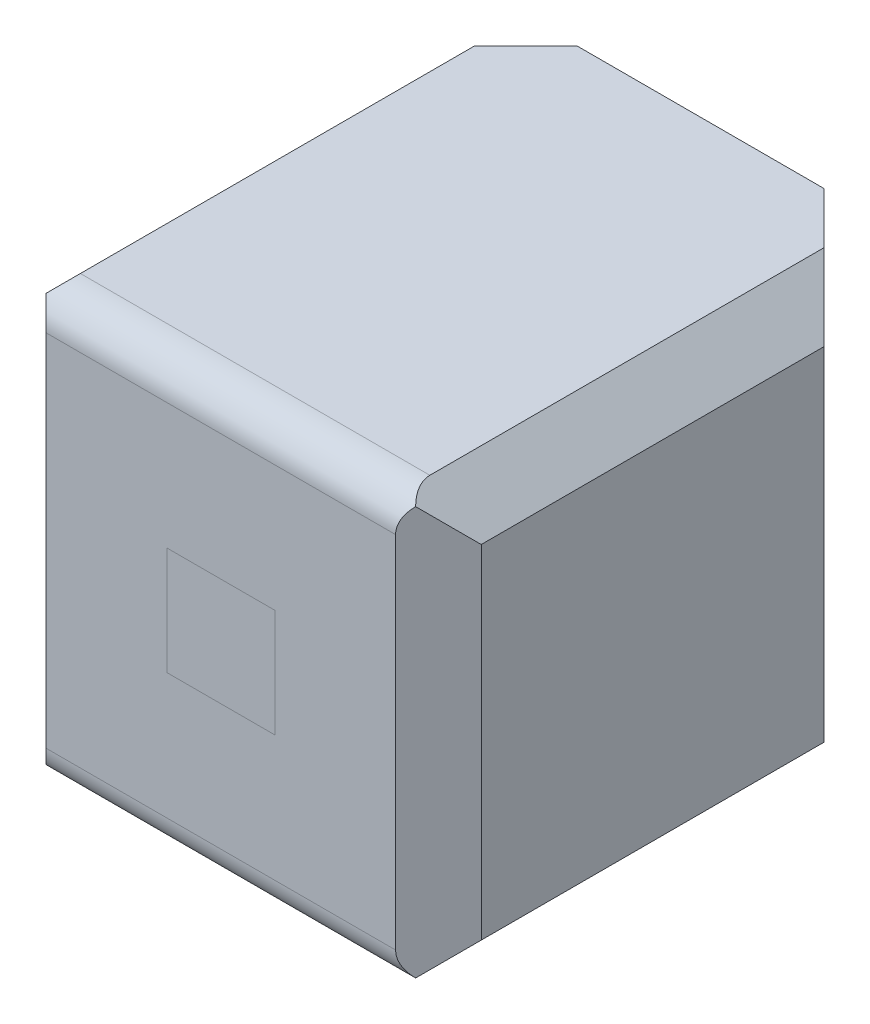
ISO-10303-21;
HEADER;
FILE_DESCRIPTION(('STEP AP214'),'2;1');
FILE_NAME('part.step','',(''),(''),'','','');
FILE_SCHEMA(('AUTOMOTIVE_DESIGN { 1 0 10303 214 1 1 1 1 }'));
ENDSEC;
DATA;
#1=APPLICATION_CONTEXT('core data for automotive mechanical design processes');
#2=APPLICATION_PROTOCOL_DEFINITION('international standard','automotive_design',2000,#1);
#3=PRODUCT_CONTEXT('',#1,'mechanical');
#4=PRODUCT('Part','Part','',(#3));
#5=PRODUCT_RELATED_PRODUCT_CATEGORY('part','',(#4));
#6=PRODUCT_DEFINITION_FORMATION('','',#4);
#7=PRODUCT_DEFINITION_CONTEXT('part definition',#1,'design');
#8=PRODUCT_DEFINITION('design','',#6,#7);
#9=PRODUCT_DEFINITION_SHAPE('','',#8);
#10=(LENGTH_UNIT() NAMED_UNIT(*) SI_UNIT(.MILLI.,.METRE.));
#11=(NAMED_UNIT(*) PLANE_ANGLE_UNIT() SI_UNIT($,.RADIAN.));
#12=(NAMED_UNIT(*) SI_UNIT($,.STERADIAN.) SOLID_ANGLE_UNIT());
#13=UNCERTAINTY_MEASURE_WITH_UNIT(LENGTH_MEASURE(1.E-05),#10,'distance_accuracy_value','');
#14=(GEOMETRIC_REPRESENTATION_CONTEXT(3) GLOBAL_UNCERTAINTY_ASSIGNED_CONTEXT((#13)) GLOBAL_UNIT_ASSIGNED_CONTEXT((#10,
#11,#12)) REPRESENTATION_CONTEXT('',''));
#15=CARTESIAN_POINT('',(0.,0.,0.));
#16=DIRECTION('',(0.,0.,1.));
#17=DIRECTION('',(1.,0.,0.));
#18=AXIS2_PLACEMENT_3D('',#15,#16,#17);
#19=CARTESIAN_POINT('',(-7.935,-0.315,4.415));
#20=DIRECTION('',(0.,0.,-1.));
#21=DIRECTION('',(0.,1.,0.));
#22=AXIS2_PLACEMENT_3D('',#19,#20,#21);
#23=PLANE('',#22);
#24=DIRECTION('',(0.,1.,0.));
#25=VECTOR('',#24,1.);
#26=CARTESIAN_POINT('',(-7.935,1.26,4.415));
#27=LINE('',#26,#25);
#28=CARTESIAN_POINT('',(-7.935,-0.315,4.415));
#29=VERTEX_POINT('',#28);
#30=CARTESIAN_POINT('',(-7.935,0.315,4.415));
#31=VERTEX_POINT('',#30);
#32=EDGE_CURVE('E11',#29,#31,#27,.T.);
#33=ORIENTED_EDGE('',*,*,#32,.F.);
#34=DIRECTION('',(-1.,0.,0.));
#35=VECTOR('',#34,1.);
#36=CARTESIAN_POINT('',(-8.844,-0.315,4.415));
#37=LINE('',#36,#35);
#38=CARTESIAN_POINT('',(-7.305,-0.315,4.415));
#39=VERTEX_POINT('',#38);
#40=EDGE_CURVE('E25',#39,#29,#37,.T.);
#41=ORIENTED_EDGE('',*,*,#40,.F.);
#42=DIRECTION('',(0.,-1.,0.));
#43=VECTOR('',#42,1.);
#44=CARTESIAN_POINT('',(-7.305,1.26,4.415));
#45=LINE('',#44,#43);
#46=CARTESIAN_POINT('',(-7.305,0.315,4.415));
#47=VERTEX_POINT('',#46);
#48=EDGE_CURVE('E399',#47,#39,#45,.T.);
#49=ORIENTED_EDGE('',*,*,#48,.F.);
#50=DIRECTION('',(1.,0.,0.));
#51=VECTOR('',#50,1.);
#52=CARTESIAN_POINT('',(-8.844,0.315,4.415));
#53=LINE('',#52,#51);
#54=EDGE_CURVE('E396',#31,#47,#53,.T.);
#55=ORIENTED_EDGE('',*,*,#54,.F.);
#56=EDGE_LOOP('',(#33,#41,#49,#55));
#57=FACE_BOUND('',#56,.T.);
#58=ADVANCED_FACE('F17',(#57),#23,.F.);
#59=CARTESIAN_POINT('',(-7.935,0.315,1.915));
#60=DIRECTION('',(0.,0.,1.));
#61=DIRECTION('',(0.,-1.,0.));
#62=AXIS2_PLACEMENT_3D('',#59,#60,#61);
#63=PLANE('',#62);
#64=DIRECTION('',(0.,-1.,0.));
#65=VECTOR('',#64,1.);
#66=CARTESIAN_POINT('',(-7.935,-0.84,1.915));
#67=LINE('',#66,#65);
#68=CARTESIAN_POINT('',(-7.935,0.315,1.915));
#69=VERTEX_POINT('',#68);
#70=CARTESIAN_POINT('',(-7.935,-0.315,1.915));
#71=VERTEX_POINT('',#70);
#72=EDGE_CURVE('E393',#69,#71,#67,.T.);
#73=ORIENTED_EDGE('',*,*,#72,.F.);
#74=DIRECTION('',(-1.,0.,0.));
#75=VECTOR('',#74,1.);
#76=CARTESIAN_POINT('',(-8.844,0.315,1.915));
#77=LINE('',#76,#75);
#78=CARTESIAN_POINT('',(-7.305,0.315,1.915));
#79=VERTEX_POINT('',#78);
#80=EDGE_CURVE('E389',#79,#69,#77,.T.);
#81=ORIENTED_EDGE('',*,*,#80,.F.);
#82=DIRECTION('',(0.,1.,0.));
#83=VECTOR('',#82,1.);
#84=CARTESIAN_POINT('',(-7.305,-0.84,1.915));
#85=LINE('',#84,#83);
#86=CARTESIAN_POINT('',(-7.305,-0.315,1.915));
#87=VERTEX_POINT('',#86);
#88=EDGE_CURVE('E385',#87,#79,#85,.T.);
#89=ORIENTED_EDGE('',*,*,#88,.F.);
#90=DIRECTION('',(1.,0.,0.));
#91=VECTOR('',#90,1.);
#92=CARTESIAN_POINT('',(-8.844,-0.315,1.915));
#93=LINE('',#92,#91);
#94=EDGE_CURVE('E381',#71,#87,#93,.T.);
#95=ORIENTED_EDGE('',*,*,#94,.F.);
#96=EDGE_LOOP('',(#73,#81,#89,#95));
#97=FACE_BOUND('',#96,.T.);
#98=ADVANCED_FACE('F407',(#97),#63,.F.);
#99=CARTESIAN_POINT('',(-8.89,-1.2,1.965));
#100=DIRECTION('',(-1.,0.,0.));
#101=DIRECTION('',(0.,0.,1.));
#102=AXIS2_PLACEMENT_3D('',#99,#100,#101);
#103=PLANE('',#102);
#104=DIRECTION('',(0.,-1.,0.));
#105=VECTOR('',#104,1.);
#106=CARTESIAN_POINT('',(-8.89,1.4297056274844,4.165));
#107=LINE('',#106,#105);
#108=CARTESIAN_POINT('',(-8.89,1.,4.165));
#109=VERTEX_POINT('',#108);
#110=CARTESIAN_POINT('',(-8.89,-1.,4.165));
#111=VERTEX_POINT('',#110);
#112=EDGE_CURVE('E378',#109,#111,#107,.T.);
#113=ORIENTED_EDGE('',*,*,#112,.F.);
#114=DIRECTION('',(0.,0.,1.));
#115=VECTOR('',#114,1.);
#116=CARTESIAN_POINT('',(-8.89,1.,1.67085786437627));
#117=LINE('',#116,#115);
#118=CARTESIAN_POINT('',(-8.89,1.,2.16499999999996));
#119=VERTEX_POINT('',#118);
#120=EDGE_CURVE('E374',#119,#109,#117,.T.);
#121=ORIENTED_EDGE('',*,*,#120,.F.);
#122=DIRECTION('',(0.,1.,0.));
#123=VECTOR('',#122,1.);
#124=CARTESIAN_POINT('',(-8.89,1.5,2.16499999999996));
#125=LINE('',#124,#123);
#126=CARTESIAN_POINT('',(-8.89,-1.,2.16499999999995));
#127=VERTEX_POINT('',#126);
#128=EDGE_CURVE('E370',#127,#119,#125,.T.);
#129=ORIENTED_EDGE('',*,*,#128,.F.);
#130=DIRECTION('',(0.,0.,-1.));
#131=VECTOR('',#130,1.);
#132=CARTESIAN_POINT('',(-8.89,-1.,1.67085786437627));
#133=LINE('',#132,#131);
#134=EDGE_CURVE('E366',#111,#127,#133,.T.);
#135=ORIENTED_EDGE('',*,*,#134,.F.);
#136=EDGE_LOOP('',(#113,#121,#129,#135));
#137=FACE_BOUND('',#136,.T.);
#138=ADVANCED_FACE('F412',(#137),#103,.T.);
#139=CARTESIAN_POINT('',(-9.33926406871194,1.4297056274844,3.71573593128808));
#140=DIRECTION('',(-0.707106781186542,0.,0.707106781186553));
#141=DIRECTION('',(0.,1.,0.));
#142=AXIS2_PLACEMENT_3D('',#139,#140,#141);
#143=PLANE('',#142);
#144=CARTESIAN_POINT('',(-8.84,1.05,4.215));
#145=DIRECTION('',(0.707106781186542,0.,-0.707106781186553));
#146=DIRECTION('',(0.707106781186553,0.,0.707106781186542));
#147=AXIS2_PLACEMENT_3D('',#144,#145,#146);
#148=ELLIPSE('',#147,0.28284271247462,0.2);
#149=CARTESIAN_POINT('',(-8.69857864376258,1.19142135623743,4.35642135623719));
#150=VERTEX_POINT('',#149);
#151=CARTESIAN_POINT('',(-8.64,1.05,4.415));
#152=VERTEX_POINT('',#151);
#153=EDGE_CURVE('E363',#150,#152,#148,.T.);
#154=ORIENTED_EDGE('',*,*,#153,.F.);
#155=DIRECTION('',(0.577350269190128,0.577350269190118,0.577350269188631));
#156=VECTOR('',#155,1.);
#157=CARTESIAN_POINT('',(-8.89,1.,4.165));
#158=LINE('',#157,#156);
#159=EDGE_CURVE('E359',#109,#150,#158,.T.);
#160=ORIENTED_EDGE('',*,*,#159,.F.);
#161=ORIENTED_EDGE('',*,*,#112,.T.);
#162=DIRECTION('',(-0.577350269190122,0.577350269190124,-0.577350269188631));
#163=VECTOR('',#162,1.);
#164=CARTESIAN_POINT('',(-8.6985786437617,-1.1914213562383,4.35642135623781));
#165=LINE('',#164,#163);
#166=CARTESIAN_POINT('',(-8.69857864376258,-1.19142135623743,4.35642135623719));
#167=VERTEX_POINT('',#166);
#168=EDGE_CURVE('E355',#167,#111,#165,.T.);
#169=ORIENTED_EDGE('',*,*,#168,.F.);
#170=CARTESIAN_POINT('',(-8.84,-1.05,4.215));
#171=DIRECTION('',(0.707106781186542,0.,-0.707106781186553));
#172=DIRECTION('',(0.707106781186553,0.,0.707106781186542));
#173=AXIS2_PLACEMENT_3D('',#170,#171,#172);
#174=ELLIPSE('',#173,0.28284271247462,0.2);
#175=CARTESIAN_POINT('',(-8.64,-1.05,4.415));
#176=VERTEX_POINT('',#175);
#177=EDGE_CURVE('E351',#176,#167,#174,.T.);
#178=ORIENTED_EDGE('',*,*,#177,.F.);
#179=DIRECTION('',(0.,-1.,0.));
#180=VECTOR('',#179,1.);
#181=CARTESIAN_POINT('',(-8.64,1.26,4.415));
#182=LINE('',#181,#180);
#183=EDGE_CURVE('E347',#152,#176,#182,.T.);
#184=ORIENTED_EDGE('',*,*,#183,.F.);
#185=EDGE_LOOP('',(#154,#160,#161,#169,#178,#184));
#186=FACE_BOUND('',#185,.T.);
#187=ADVANCED_FACE('F417',(#186),#143,.T.);
#188=CARTESIAN_POINT('',(-8.19073593128808,-1.69926406871193,1.67085786437627));
#189=DIRECTION('',(-0.707106781186549,-0.707106781186546,0.));
#190=DIRECTION('',(-0.707106781186546,0.707106781186549,0.));
#191=AXIS2_PLACEMENT_3D('',#188,#189,#190);
#192=PLANE('',#191);
#193=DIRECTION('',(0.,0.,-1.));
#194=VECTOR('',#193,1.);
#195=CARTESIAN_POINT('',(-8.64,-1.25,4.475));
#196=LINE('',#195,#194);
#197=CARTESIAN_POINT('',(-8.64,-1.25,4.215));
#198=VERTEX_POINT('',#197);
#199=CARTESIAN_POINT('',(-8.64,-1.25,1.915));
#200=VERTEX_POINT('',#199);
#201=EDGE_CURVE('E344',#198,#200,#196,.T.);
#202=ORIENTED_EDGE('',*,*,#201,.F.);
#203=CARTESIAN_POINT('',(-8.84,-1.05,4.215));
#204=DIRECTION('',(0.707106781186549,0.707106781186546,0.));
#205=DIRECTION('',(0.707106781186546,-0.707106781186549,0.));
#206=AXIS2_PLACEMENT_3D('',#203,#204,#205);
#207=ELLIPSE('',#206,0.282842712474617,0.2);
#208=EDGE_CURVE('E340',#167,#198,#207,.T.);
#209=ORIENTED_EDGE('',*,*,#208,.F.);
#210=ORIENTED_EDGE('',*,*,#168,.T.);
#211=ORIENTED_EDGE('',*,*,#134,.T.);
#212=DIRECTION('',(-0.577350269189672,0.577350269189619,0.577350269189587));
#213=VECTOR('',#212,1.);
#214=CARTESIAN_POINT('',(-8.64,-1.25,1.915));
#215=LINE('',#214,#213);
#216=EDGE_CURVE('E336',#200,#127,#215,.T.);
#217=ORIENTED_EDGE('',*,*,#216,.F.);
#218=EDGE_LOOP('',(#202,#209,#210,#211,#217));
#219=FACE_BOUND('',#218,.T.);
#220=ADVANCED_FACE('F423',(#219),#192,.T.);
#221=CARTESIAN_POINT('',(-9.33926406871194,0.550735931288075,1.67085786437627));
#222=DIRECTION('',(-0.707106781186542,0.707106781186553,0.));
#223=DIRECTION('',(0.,0.,1.));
#224=AXIS2_PLACEMENT_3D('',#221,#222,#223);
#225=PLANE('',#224);
#226=ORIENTED_EDGE('',*,*,#159,.T.);
#227=CARTESIAN_POINT('',(-8.84,1.05,4.215));
#228=DIRECTION('',(0.707106781186542,-0.707106781186553,0.));
#229=DIRECTION('',(0.707106781186553,0.707106781186542,0.));
#230=AXIS2_PLACEMENT_3D('',#227,#228,#229);
#231=ELLIPSE('',#230,0.28284271247462,0.2);
#232=CARTESIAN_POINT('',(-8.64,1.25,4.215));
#233=VERTEX_POINT('',#232);
#234=EDGE_CURVE('E332',#233,#150,#231,.T.);
#235=ORIENTED_EDGE('',*,*,#234,.F.);
#236=DIRECTION('',(0.,0.,1.));
#237=VECTOR('',#236,1.);
#238=CARTESIAN_POINT('',(-8.64,1.25,1.355));
#239=LINE('',#238,#237);
#240=CARTESIAN_POINT('',(-8.64,1.25,1.915));
#241=VERTEX_POINT('',#240);
#242=EDGE_CURVE('E328',#241,#233,#239,.T.);
#243=ORIENTED_EDGE('',*,*,#242,.F.);
#244=DIRECTION('',(0.577350269189671,0.57735026918962,-0.577350269189587));
#245=VECTOR('',#244,1.);
#246=CARTESIAN_POINT('',(-8.89,1.,2.16499999999996));
#247=LINE('',#246,#245);
#248=EDGE_CURVE('E324',#119,#241,#247,.T.);
#249=ORIENTED_EDGE('',*,*,#248,.F.);
#250=ORIENTED_EDGE('',*,*,#120,.T.);
#251=EDGE_LOOP('',(#226,#235,#243,#249,#250));
#252=FACE_BOUND('',#251,.T.);
#253=ADVANCED_FACE('F427',(#252),#225,.T.);
#254=CARTESIAN_POINT('',(-7.86073593128804,1.5,1.13573593128811));
#255=DIRECTION('',(-0.707106781186496,0.,-0.7071067811866));
#256=DIRECTION('',(-0.7071067811866,0.,0.707106781186496));
#257=AXIS2_PLACEMENT_3D('',#254,#255,#256);
#258=PLANE('',#257);
#259=ORIENTED_EDGE('',*,*,#128,.T.);
#260=ORIENTED_EDGE('',*,*,#248,.T.);
#261=DIRECTION('',(-0.707106781186559,0.,0.707106781186536));
#262=VECTOR('',#261,1.);
#263=CARTESIAN_POINT('',(-8.34,1.25,1.615));
#264=LINE('',#263,#262);
#265=CARTESIAN_POINT('',(-8.34,1.25,1.615));
#266=VERTEX_POINT('',#265);
#267=EDGE_CURVE('E320',#266,#241,#264,.T.);
#268=ORIENTED_EDGE('',*,*,#267,.F.);
#269=DIRECTION('',(0.,1.,0.));
#270=VECTOR('',#269,1.);
#271=CARTESIAN_POINT('',(-8.34,0.045,1.615));
#272=LINE('',#271,#270);
#273=CARTESIAN_POINT('',(-8.34,0.7,1.615));
#274=VERTEX_POINT('',#273);
#275=EDGE_CURVE('E316',#274,#266,#272,.T.);
#276=ORIENTED_EDGE('',*,*,#275,.F.);
#277=DIRECTION('',(0.707106781186559,0.,-0.707106781186536));
#278=VECTOR('',#277,1.);
#279=CARTESIAN_POINT('',(-8.64,0.7,1.915));
#280=LINE('',#279,#278);
#281=CARTESIAN_POINT('',(-8.64,0.7,1.915));
#282=VERTEX_POINT('',#281);
#283=EDGE_CURVE('E312',#282,#274,#280,.T.);
#284=ORIENTED_EDGE('',*,*,#283,.F.);
#285=DIRECTION('',(0.,1.,0.));
#286=VECTOR('',#285,1.);
#287=CARTESIAN_POINT('',(-8.64,-0.84,1.915));
#288=LINE('',#287,#286);
#289=CARTESIAN_POINT('',(-8.64,-0.7,1.915));
#290=VERTEX_POINT('',#289);
#291=EDGE_CURVE('E308',#290,#282,#288,.T.);
#292=ORIENTED_EDGE('',*,*,#291,.F.);
#293=DIRECTION('',(-0.707106781186559,0.,0.707106781186536));
#294=VECTOR('',#293,1.);
#295=CARTESIAN_POINT('',(-8.34,-0.7,1.615));
#296=LINE('',#295,#294);
#297=CARTESIAN_POINT('',(-8.34,-0.7,1.615));
#298=VERTEX_POINT('',#297);
#299=EDGE_CURVE('E304',#298,#290,#296,.T.);
#300=ORIENTED_EDGE('',*,*,#299,.F.);
#301=DIRECTION('',(0.,1.,0.));
#302=VECTOR('',#301,1.);
#303=CARTESIAN_POINT('',(-8.34,-1.905,1.615));
#304=LINE('',#303,#302);
#305=CARTESIAN_POINT('',(-8.34,-1.25,1.615));
#306=VERTEX_POINT('',#305);
#307=EDGE_CURVE('E300',#306,#298,#304,.T.);
#308=ORIENTED_EDGE('',*,*,#307,.F.);
#309=DIRECTION('',(0.707106781186548,0.,-0.707106781186548));
#310=VECTOR('',#309,1.);
#311=CARTESIAN_POINT('',(-8.64,-1.25,1.915));
#312=LINE('',#311,#310);
#313=EDGE_CURVE('E296',#200,#306,#312,.T.);
#314=ORIENTED_EDGE('',*,*,#313,.F.);
#315=ORIENTED_EDGE('',*,*,#216,.T.);
#316=EDGE_LOOP('',(#259,#260,#268,#276,#284,#292,#300,#308,#314,#315));
#317=FACE_BOUND('',#316,.T.);
#318=ADVANCED_FACE('F431',(#317),#258,.T.);
#319=CARTESIAN_POINT('',(-8.914294372512,1.05,4.215));
#320=DIRECTION('',(1.,0.,0.));
#321=DIRECTION('',(0.,0.,-1.));
#322=AXIS2_PLACEMENT_3D('',#319,#320,#321);
#323=CYLINDRICAL_SURFACE('',#322,0.2);
#324=CARTESIAN_POINT('',(-6.4,1.05,4.215));
#325=DIRECTION('',(0.707106781186549,0.707106781186546,0.));
#326=DIRECTION('',(0.707106781186546,-0.707106781186549,0.));
#327=AXIS2_PLACEMENT_3D('',#324,#325,#326);
#328=ELLIPSE('',#327,0.282842712474618,0.2);
#329=CARTESIAN_POINT('',(-6.6,1.25,4.215));
#330=VERTEX_POINT('',#329);
#331=CARTESIAN_POINT('',(-6.54142135623752,1.19142135623708,4.35642135623753));
#332=VERTEX_POINT('',#331);
#333=EDGE_CURVE('E293',#330,#332,#328,.T.);
#334=ORIENTED_EDGE('',*,*,#333,.F.);
#335=DIRECTION('',(1.,0.,0.));
#336=VECTOR('',#335,1.);
#337=CARTESIAN_POINT('',(-8.844,1.25,4.215));
#338=LINE('',#337,#336);
#339=EDGE_CURVE('E289',#233,#330,#338,.T.);
#340=ORIENTED_EDGE('',*,*,#339,.F.);
#341=ORIENTED_EDGE('',*,*,#234,.T.);
#342=ORIENTED_EDGE('',*,*,#153,.T.);
#343=DIRECTION('',(-1.,0.,0.));
#344=VECTOR('',#343,1.);
#345=CARTESIAN_POINT('',(-8.844,1.05,4.415));
#346=LINE('',#345,#344);
#347=CARTESIAN_POINT('',(-6.6,1.05,4.415));
#348=VERTEX_POINT('',#347);
#349=EDGE_CURVE('E285',#348,#152,#346,.T.);
#350=ORIENTED_EDGE('',*,*,#349,.F.);
#351=CARTESIAN_POINT('',(-6.4,1.05,4.215));
#352=DIRECTION('',(0.707106781186549,0.,0.707106781186546));
#353=DIRECTION('',(0.707106781186546,0.,-0.707106781186549));
#354=AXIS2_PLACEMENT_3D('',#351,#352,#353);
#355=ELLIPSE('',#354,0.282842712474618,0.2);
#356=EDGE_CURVE('E281',#332,#348,#355,.T.);
#357=ORIENTED_EDGE('',*,*,#356,.F.);
#358=EDGE_LOOP('',(#334,#340,#341,#342,#350,#357));
#359=FACE_BOUND('',#358,.T.);
#360=ADVANCED_FACE('F435',(#359),#323,.T.);
#361=CARTESIAN_POINT('',(-8.844,1.26,4.415));
#362=DIRECTION('',(0.,0.,1.));
#363=DIRECTION('',(1.,0.,0.));
#364=AXIS2_PLACEMENT_3D('',#361,#362,#363);
#365=PLANE('',#364);
#366=ORIENTED_EDGE('',*,*,#40,.T.);
#367=ORIENTED_EDGE('',*,*,#32,.T.);
#368=ORIENTED_EDGE('',*,*,#54,.T.);
#369=ORIENTED_EDGE('',*,*,#48,.T.);
#370=EDGE_LOOP('',(#366,#367,#368,#369));
#371=FACE_BOUND('',#370,.T.);
#372=DIRECTION('',(0.,-1.,0.));
#373=VECTOR('',#372,1.);
#374=CARTESIAN_POINT('',(-6.6,1.4297056274844,4.415));
#375=LINE('',#374,#373);
#376=CARTESIAN_POINT('',(-6.6,-1.05,4.415));
#377=VERTEX_POINT('',#376);
#378=EDGE_CURVE('E278',#348,#377,#375,.T.);
#379=ORIENTED_EDGE('',*,*,#378,.F.);
#380=ORIENTED_EDGE('',*,*,#349,.T.);
#381=ORIENTED_EDGE('',*,*,#183,.T.);
#382=DIRECTION('',(-1.,0.,0.));
#383=VECTOR('',#382,1.);
#384=CARTESIAN_POINT('',(-8.914294372512,-1.05,4.415));
#385=LINE('',#384,#383);
#386=EDGE_CURVE('E274',#377,#176,#385,.T.);
#387=ORIENTED_EDGE('',*,*,#386,.F.);
#388=EDGE_LOOP('',(#379,#380,#381,#387));
#389=FACE_BOUND('',#388,.T.);
#390=ADVANCED_FACE('F404',(#371,#389),#365,.T.);
#391=CARTESIAN_POINT('',(-8.914294372512,-1.05,4.215));
#392=DIRECTION('',(1.,0.,0.));
#393=DIRECTION('',(0.,0.,-1.));
#394=AXIS2_PLACEMENT_3D('',#391,#392,#393);
#395=CYLINDRICAL_SURFACE('',#394,0.2);
#396=ORIENTED_EDGE('',*,*,#386,.T.);
#397=ORIENTED_EDGE('',*,*,#177,.T.);
#398=ORIENTED_EDGE('',*,*,#208,.T.);
#399=DIRECTION('',(-1.,0.,0.));
#400=VECTOR('',#399,1.);
#401=CARTESIAN_POINT('',(-8.844,-1.25,4.215));
#402=LINE('',#401,#400);
#403=CARTESIAN_POINT('',(-6.6,-1.25,4.215));
#404=VERTEX_POINT('',#403);
#405=EDGE_CURVE('E270',#404,#198,#402,.T.);
#406=ORIENTED_EDGE('',*,*,#405,.F.);
#407=CARTESIAN_POINT('',(-6.4,-1.05,4.215));
#408=DIRECTION('',(0.707106781186543,-0.707106781186552,0.));
#409=DIRECTION('',(0.707106781186552,0.707106781186543,0.));
#410=AXIS2_PLACEMENT_3D('',#407,#408,#409);
#411=ELLIPSE('',#410,0.282842712474621,0.2);
#412=CARTESIAN_POINT('',(-6.54142135623743,-1.19142135623743,4.35642135623719));
#413=VERTEX_POINT('',#412);
#414=EDGE_CURVE('E267',#413,#404,#411,.T.);
#415=ORIENTED_EDGE('',*,*,#414,.F.);
#416=CARTESIAN_POINT('',(-6.4,-1.05,4.215));
#417=DIRECTION('',(0.707106781186549,0.,0.707106781186546));
#418=DIRECTION('',(0.707106781186546,0.,-0.707106781186549));
#419=AXIS2_PLACEMENT_3D('',#416,#417,#418);
#420=ELLIPSE('',#419,0.282842712474618,0.2);
#421=EDGE_CURVE('E263',#377,#413,#420,.T.);
#422=ORIENTED_EDGE('',*,*,#421,.F.);
#423=EDGE_LOOP('',(#396,#397,#398,#406,#415,#422));
#424=FACE_BOUND('',#423,.T.);
#425=ADVANCED_FACE('F442',(#424),#395,.T.);
#426=CARTESIAN_POINT('',(-8.844,-1.25,4.475));
#427=DIRECTION('',(0.,-1.,0.));
#428=DIRECTION('',(0.,0.,-1.));
#429=AXIS2_PLACEMENT_3D('',#426,#427,#428);
#430=PLANE('',#429);
#431=DIRECTION('',(0.,0.,-1.));
#432=VECTOR('',#431,1.);
#433=CARTESIAN_POINT('',(-6.6,-1.25,1.67085786437627));
#434=LINE('',#433,#432);
#435=CARTESIAN_POINT('',(-6.6,-1.25,1.915));
#436=VERTEX_POINT('',#435);
#437=EDGE_CURVE('E169',#404,#436,#434,.T.);
#438=ORIENTED_EDGE('',*,*,#437,.F.);
#439=ORIENTED_EDGE('',*,*,#405,.T.);
#440=ORIENTED_EDGE('',*,*,#201,.T.);
#441=ORIENTED_EDGE('',*,*,#313,.T.);
#442=DIRECTION('',(-1.,0.,0.));
#443=VECTOR('',#442,1.);
#444=CARTESIAN_POINT('',(-8.484,-1.25,1.615));
#445=LINE('',#444,#443);
#446=CARTESIAN_POINT('',(-6.9,-1.25,1.615));
#447=VERTEX_POINT('',#446);
#448=EDGE_CURVE('E257',#447,#306,#445,.T.);
#449=ORIENTED_EDGE('',*,*,#448,.F.);
#450=DIRECTION('',(-0.707106781186552,0.,-0.707106781186543));
#451=VECTOR('',#450,1.);
#452=CARTESIAN_POINT('',(-5.87073593128807,-1.25,2.64426406871193));
#453=LINE('',#452,#451);
#454=EDGE_CURVE('E254',#436,#447,#453,.T.);
#455=ORIENTED_EDGE('',*,*,#454,.F.);
#456=EDGE_LOOP('',(#438,#439,#440,#441,#449,#455));
#457=FACE_BOUND('',#456,.T.);
#458=ADVANCED_FACE('F445',(#457),#430,.T.);
#459=CARTESIAN_POINT('',(-8.484,-1.905,1.615));
#460=DIRECTION('',(0.,0.,-1.));
#461=DIRECTION('',(0.,-1.,0.));
#462=AXIS2_PLACEMENT_3D('',#459,#460,#461);
#463=PLANE('',#462);
#464=DIRECTION('',(0.,1.,0.));
#465=VECTOR('',#464,1.);
#466=CARTESIAN_POINT('',(-6.9,1.5,1.615));
#467=LINE('',#466,#465);
#468=CARTESIAN_POINT('',(-6.9,-0.7,1.615));
#469=VERTEX_POINT('',#468);
#470=EDGE_CURVE('E251',#447,#469,#467,.T.);
#471=ORIENTED_EDGE('',*,*,#470,.F.);
#472=ORIENTED_EDGE('',*,*,#448,.T.);
#473=ORIENTED_EDGE('',*,*,#307,.T.);
#474=DIRECTION('',(-1.,0.,0.));
#475=VECTOR('',#474,1.);
#476=CARTESIAN_POINT('',(-8.844,-0.7,1.615));
#477=LINE('',#476,#475);
#478=EDGE_CURVE('E247',#469,#298,#477,.T.);
#479=ORIENTED_EDGE('',*,*,#478,.F.);
#480=EDGE_LOOP('',(#471,#472,#473,#479));
#481=FACE_BOUND('',#480,.T.);
#482=ADVANCED_FACE('F449',(#481),#463,.T.);
#483=CARTESIAN_POINT('',(-8.844,-0.7,0.985));
#484=DIRECTION('',(0.,1.,0.));
#485=DIRECTION('',(1.,0.,0.));
#486=AXIS2_PLACEMENT_3D('',#483,#484,#485);
#487=PLANE('',#486);
#488=DIRECTION('',(0.707106781186552,0.,0.707106781186543));
#489=VECTOR('',#488,1.);
#490=CARTESIAN_POINT('',(-5.87073593128807,-0.7,2.64426406871193));
#491=LINE('',#490,#489);
#492=CARTESIAN_POINT('',(-6.6,-0.7,1.915));
#493=VERTEX_POINT('',#492);
#494=EDGE_CURVE('E244',#469,#493,#491,.T.);
#495=ORIENTED_EDGE('',*,*,#494,.F.);
#496=ORIENTED_EDGE('',*,*,#478,.T.);
#497=ORIENTED_EDGE('',*,*,#299,.T.);
#498=DIRECTION('',(-1.,0.,0.));
#499=VECTOR('',#498,1.);
#500=CARTESIAN_POINT('',(-8.844,-0.7,1.915));
#501=LINE('',#500,#499);
#502=EDGE_CURVE('E240',#493,#290,#501,.T.);
#503=ORIENTED_EDGE('',*,*,#502,.F.);
#504=EDGE_LOOP('',(#495,#496,#497,#503));
#505=FACE_BOUND('',#504,.T.);
#506=ADVANCED_FACE('F453',(#505),#487,.T.);
#507=CARTESIAN_POINT('',(-8.844,-0.84,1.915));
#508=DIRECTION('',(0.,0.,-1.));
#509=DIRECTION('',(0.,-1.,0.));
#510=AXIS2_PLACEMENT_3D('',#507,#508,#509);
#511=PLANE('',#510);
#512=ORIENTED_EDGE('',*,*,#80,.T.);
#513=ORIENTED_EDGE('',*,*,#72,.T.);
#514=ORIENTED_EDGE('',*,*,#94,.T.);
#515=ORIENTED_EDGE('',*,*,#88,.T.);
#516=EDGE_LOOP('',(#512,#513,#514,#515));
#517=FACE_BOUND('',#516,.T.);
#518=DIRECTION('',(0.,1.,0.));
#519=VECTOR('',#518,1.);
#520=CARTESIAN_POINT('',(-6.6,1.5,1.915));
#521=LINE('',#520,#519);
#522=CARTESIAN_POINT('',(-6.6,0.7,1.915));
#523=VERTEX_POINT('',#522);
#524=EDGE_CURVE('E237',#493,#523,#521,.T.);
#525=ORIENTED_EDGE('',*,*,#524,.F.);
#526=ORIENTED_EDGE('',*,*,#502,.T.);
#527=ORIENTED_EDGE('',*,*,#291,.T.);
#528=DIRECTION('',(-1.,0.,0.));
#529=VECTOR('',#528,1.);
#530=CARTESIAN_POINT('',(-8.844,0.7,1.915));
#531=LINE('',#530,#529);
#532=EDGE_CURVE('E233',#523,#282,#531,.T.);
#533=ORIENTED_EDGE('',*,*,#532,.F.);
#534=EDGE_LOOP('',(#525,#526,#527,#533));
#535=FACE_BOUND('',#534,.T.);
#536=ADVANCED_FACE('F457',(#517,#535),#511,.T.);
#537=CARTESIAN_POINT('',(-8.844,0.7,2.545));
#538=DIRECTION('',(0.,-1.,0.));
#539=DIRECTION('',(0.,0.,-1.));
#540=AXIS2_PLACEMENT_3D('',#537,#538,#539);
#541=PLANE('',#540);
#542=DIRECTION('',(-0.707106781186552,0.,-0.707106781186543));
#543=VECTOR('',#542,1.);
#544=CARTESIAN_POINT('',(-5.87073593128807,0.7,2.64426406871193));
#545=LINE('',#544,#543);
#546=CARTESIAN_POINT('',(-6.9,0.7,1.615));
#547=VERTEX_POINT('',#546);
#548=EDGE_CURVE('E230',#523,#547,#545,.T.);
#549=ORIENTED_EDGE('',*,*,#548,.F.);
#550=ORIENTED_EDGE('',*,*,#532,.T.);
#551=ORIENTED_EDGE('',*,*,#283,.T.);
#552=DIRECTION('',(-1.,0.,0.));
#553=VECTOR('',#552,1.);
#554=CARTESIAN_POINT('',(-8.484,0.7,1.615));
#555=LINE('',#554,#553);
#556=EDGE_CURVE('E226',#547,#274,#555,.T.);
#557=ORIENTED_EDGE('',*,*,#556,.F.);
#558=EDGE_LOOP('',(#549,#550,#551,#557));
#559=FACE_BOUND('',#558,.T.);
#560=ADVANCED_FACE('F461',(#559),#541,.T.);
#561=CARTESIAN_POINT('',(-8.484,0.045,1.615));
#562=DIRECTION('',(0.,0.,-1.));
#563=DIRECTION('',(0.,-1.,0.));
#564=AXIS2_PLACEMENT_3D('',#561,#562,#563);
#565=PLANE('',#564);
#566=DIRECTION('',(0.,1.,0.));
#567=VECTOR('',#566,1.);
#568=CARTESIAN_POINT('',(-6.9,1.5,1.615));
#569=LINE('',#568,#567);
#570=CARTESIAN_POINT('',(-6.9,1.25,1.615));
#571=VERTEX_POINT('',#570);
#572=EDGE_CURVE('E223',#547,#571,#569,.T.);
#573=ORIENTED_EDGE('',*,*,#572,.F.);
#574=ORIENTED_EDGE('',*,*,#556,.T.);
#575=ORIENTED_EDGE('',*,*,#275,.T.);
#576=DIRECTION('',(-1.,0.,0.));
#577=VECTOR('',#576,1.);
#578=CARTESIAN_POINT('',(-8.844,1.25,1.615));
#579=LINE('',#578,#577);
#580=EDGE_CURVE('E219',#571,#266,#579,.T.);
#581=ORIENTED_EDGE('',*,*,#580,.F.);
#582=EDGE_LOOP('',(#573,#574,#575,#581));
#583=FACE_BOUND('',#582,.T.);
#584=ADVANCED_FACE('F465',(#583),#565,.T.);
#585=CARTESIAN_POINT('',(-8.844,1.25,1.355));
#586=DIRECTION('',(0.,1.,0.));
#587=DIRECTION('',(1.,0.,0.));
#588=AXIS2_PLACEMENT_3D('',#585,#586,#587);
#589=PLANE('',#588);
#590=ORIENTED_EDGE('',*,*,#580,.T.);
#591=ORIENTED_EDGE('',*,*,#267,.T.);
#592=ORIENTED_EDGE('',*,*,#242,.T.);
#593=ORIENTED_EDGE('',*,*,#339,.T.);
#594=DIRECTION('',(0.,0.,1.));
#595=VECTOR('',#594,1.);
#596=CARTESIAN_POINT('',(-6.6,1.25,1.67085786437627));
#597=LINE('',#596,#595);
#598=CARTESIAN_POINT('',(-6.6,1.25,1.915));
#599=VERTEX_POINT('',#598);
#600=EDGE_CURVE('E215',#599,#330,#597,.T.);
#601=ORIENTED_EDGE('',*,*,#600,.F.);
#602=DIRECTION('',(0.707106781186552,0.,0.707106781186543));
#603=VECTOR('',#602,1.);
#604=CARTESIAN_POINT('',(-5.87073593128807,1.25,2.64426406871193));
#605=LINE('',#604,#603);
#606=EDGE_CURVE('E212',#571,#599,#605,.T.);
#607=ORIENTED_EDGE('',*,*,#606,.F.);
#608=EDGE_LOOP('',(#590,#591,#592,#593,#601,#607));
#609=FACE_BOUND('',#608,.T.);
#610=ADVANCED_FACE('F469',(#609),#589,.T.);
#611=CARTESIAN_POINT('',(-7.04926406871192,1.69926406871193,1.67085786437627));
#612=DIRECTION('',(0.707106781186549,0.707106781186546,0.));
#613=DIRECTION('',(0.,0.,-1.));
#614=AXIS2_PLACEMENT_3D('',#611,#612,#613);
#615=PLANE('',#614);
#616=DIRECTION('',(0.577350269189622,-0.577350269189641,0.577350269189615));
#617=VECTOR('',#616,1.);
#618=CARTESIAN_POINT('',(-6.6,1.25,1.915));
#619=LINE('',#618,#617);
#620=CARTESIAN_POINT('',(-6.35,1.,2.165));
#621=VERTEX_POINT('',#620);
#622=EDGE_CURVE('E190',#599,#621,#619,.T.);
#623=ORIENTED_EDGE('',*,*,#622,.F.);
#624=ORIENTED_EDGE('',*,*,#600,.T.);
#625=ORIENTED_EDGE('',*,*,#333,.T.);
#626=DIRECTION('',(-0.577350269190514,0.577350269187847,0.577350269190517));
#627=VECTOR('',#626,1.);
#628=CARTESIAN_POINT('',(-6.35,1.,4.165));
#629=LINE('',#628,#627);
#630=CARTESIAN_POINT('',(-6.35,1.,4.165));
#631=VERTEX_POINT('',#630);
#632=EDGE_CURVE('E206',#631,#332,#629,.T.);
#633=ORIENTED_EDGE('',*,*,#632,.F.);
#634=DIRECTION('',(0.,0.,1.));
#635=VECTOR('',#634,1.);
#636=CARTESIAN_POINT('',(-6.35,1.,1.965));
#637=LINE('',#636,#635);
#638=EDGE_CURVE('E203',#621,#631,#637,.T.);
#639=ORIENTED_EDGE('',*,*,#638,.F.);
#640=EDGE_LOOP('',(#623,#624,#625,#633,#639));
#641=FACE_BOUND('',#640,.T.);
#642=ADVANCED_FACE('F473',(#641),#615,.T.);
#643=CARTESIAN_POINT('',(-7.04926406871192,1.4297056274844,4.86426406871193));
#644=DIRECTION('',(0.707106781186549,0.,0.707106781186546));
#645=DIRECTION('',(0.,-1.,0.));
#646=AXIS2_PLACEMENT_3D('',#643,#644,#645);
#647=PLANE('',#646);
#648=DIRECTION('',(0.,-1.,0.));
#649=VECTOR('',#648,1.);
#650=CARTESIAN_POINT('',(-6.35,-1.2,4.165));
#651=LINE('',#650,#649);
#652=CARTESIAN_POINT('',(-6.35,-1.,4.165));
#653=VERTEX_POINT('',#652);
#654=EDGE_CURVE('E183',#631,#653,#651,.T.);
#655=ORIENTED_EDGE('',*,*,#654,.F.);
#656=ORIENTED_EDGE('',*,*,#632,.T.);
#657=ORIENTED_EDGE('',*,*,#356,.T.);
#658=ORIENTED_EDGE('',*,*,#378,.T.);
#659=ORIENTED_EDGE('',*,*,#421,.T.);
#660=DIRECTION('',(-0.577350269190127,-0.57735026919012,0.57735026918863));
#661=VECTOR('',#660,1.);
#662=CARTESIAN_POINT('',(-6.35,-1.,4.165));
#663=LINE('',#662,#661);
#664=EDGE_CURVE('E175',#653,#413,#663,.T.);
#665=ORIENTED_EDGE('',*,*,#664,.F.);
#666=EDGE_LOOP('',(#655,#656,#657,#658,#659,#665));
#667=FACE_BOUND('',#666,.T.);
#668=ADVANCED_FACE('F477',(#667),#647,.T.);
#669=CARTESIAN_POINT('',(-5.90073593128807,-0.550735931288074,1.67085786437627));
#670=DIRECTION('',(0.707106781186543,-0.707106781186552,0.));
#671=DIRECTION('',(0.,0.,-1.));
#672=AXIS2_PLACEMENT_3D('',#669,#670,#671);
#673=PLANE('',#672);
#674=ORIENTED_EDGE('',*,*,#664,.T.);
#675=ORIENTED_EDGE('',*,*,#414,.T.);
#676=ORIENTED_EDGE('',*,*,#437,.T.);
#677=DIRECTION('',(-0.577350269189622,-0.57735026918964,-0.577350269189615));
#678=VECTOR('',#677,1.);
#679=CARTESIAN_POINT('',(-6.35,-1.,2.165));
#680=LINE('',#679,#678);
#681=CARTESIAN_POINT('',(-6.35,-1.,2.165));
#682=VERTEX_POINT('',#681);
#683=EDGE_CURVE('E162',#682,#436,#680,.T.);
#684=ORIENTED_EDGE('',*,*,#683,.F.);
#685=DIRECTION('',(0.,0.,-1.));
#686=VECTOR('',#685,1.);
#687=CARTESIAN_POINT('',(-6.35,-1.,1.965));
#688=LINE('',#687,#686);
#689=EDGE_CURVE('E166',#653,#682,#688,.T.);
#690=ORIENTED_EDGE('',*,*,#689,.F.);
#691=EDGE_LOOP('',(#674,#675,#676,#684,#690));
#692=FACE_BOUND('',#691,.T.);
#693=ADVANCED_FACE('F165',(#692),#673,.T.);
#694=CARTESIAN_POINT('',(-5.87073593128807,1.5,2.64426406871193));
#695=DIRECTION('',(0.707106781186543,0.,-0.707106781186552));
#696=DIRECTION('',(0.,-1.,0.));
#697=AXIS2_PLACEMENT_3D('',#694,#695,#696);
#698=PLANE('',#697);
#699=ORIENTED_EDGE('',*,*,#606,.T.);
#700=ORIENTED_EDGE('',*,*,#622,.T.);
#701=DIRECTION('',(0.,1.,0.));
#702=VECTOR('',#701,1.);
#703=CARTESIAN_POINT('',(-6.35,-1.2,2.165));
#704=LINE('',#703,#702);
#705=EDGE_CURVE('E181',#682,#621,#704,.T.);
#706=ORIENTED_EDGE('',*,*,#705,.F.);
#707=ORIENTED_EDGE('',*,*,#683,.T.);
#708=ORIENTED_EDGE('',*,*,#454,.T.);
#709=ORIENTED_EDGE('',*,*,#470,.T.);
#710=ORIENTED_EDGE('',*,*,#494,.T.);
#711=ORIENTED_EDGE('',*,*,#524,.T.);
#712=ORIENTED_EDGE('',*,*,#548,.T.);
#713=ORIENTED_EDGE('',*,*,#572,.T.);
#714=EDGE_LOOP('',(#699,#700,#706,#707,#708,#709,#710,#711,#712,#713));
#715=FACE_BOUND('',#714,.T.);
#716=ADVANCED_FACE('F188',(#715),#698,.T.);
#717=CARTESIAN_POINT('',(-6.35,-1.2,1.965));
#718=DIRECTION('',(1.,0.,0.));
#719=DIRECTION('',(0.,1.,0.));
#720=AXIS2_PLACEMENT_3D('',#717,#718,#719);
#721=PLANE('',#720);
#722=ORIENTED_EDGE('',*,*,#689,.T.);
#723=ORIENTED_EDGE('',*,*,#705,.T.);
#724=ORIENTED_EDGE('',*,*,#638,.T.);
#725=ORIENTED_EDGE('',*,*,#654,.T.);
#726=EDGE_LOOP('',(#722,#723,#724,#725));
#727=FACE_BOUND('',#726,.T.);
#728=ADVANCED_FACE('F179',(#727),#721,.T.);
#729=CLOSED_SHELL('',(#58,#98,#138,#187,#220,#253,#318,#360,#390,#425,#458,#482,#506,#536,#560,
#584,#610,#642,#668,#693,#716,#728));
#730=MANIFOLD_SOLID_BREP('B1',#729);
#731=ADVANCED_BREP_SHAPE_REPRESENTATION('',(#18,#730),#14);
#732=SHAPE_DEFINITION_REPRESENTATION(#9,#731);
ENDSEC;
END-ISO-10303-21;
